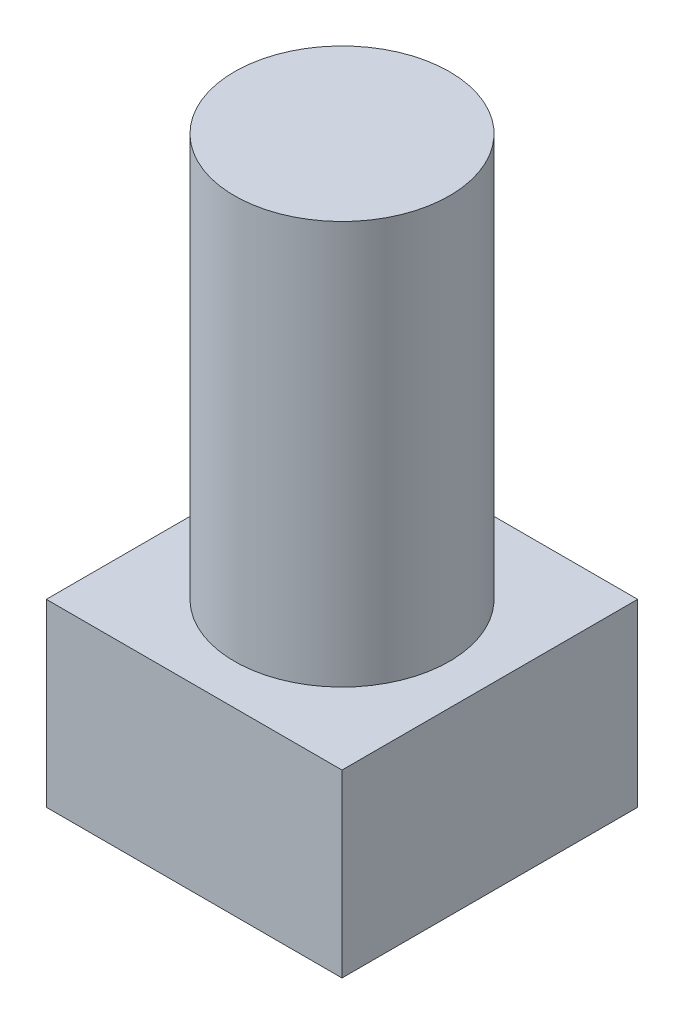
ISO-10303-21;
HEADER;
FILE_DESCRIPTION(('STEP AP214'),'2;1');
FILE_NAME('part.step','',(''),(''),'','','');
FILE_SCHEMA(('AUTOMOTIVE_DESIGN { 1 0 10303 214 1 1 1 1 }'));
ENDSEC;
DATA;
#1=APPLICATION_CONTEXT('core data for automotive mechanical design processes');
#2=APPLICATION_PROTOCOL_DEFINITION('international standard','automotive_design',2000,#1);
#3=PRODUCT_CONTEXT('',#1,'mechanical');
#4=PRODUCT('Part','Part','',(#3));
#5=PRODUCT_RELATED_PRODUCT_CATEGORY('part','',(#4));
#6=PRODUCT_DEFINITION_FORMATION('','',#4);
#7=PRODUCT_DEFINITION_CONTEXT('part definition',#1,'design');
#8=PRODUCT_DEFINITION('design','',#6,#7);
#9=PRODUCT_DEFINITION_SHAPE('','',#8);
#10=(LENGTH_UNIT() NAMED_UNIT(*) SI_UNIT(.MILLI.,.METRE.));
#11=(NAMED_UNIT(*) PLANE_ANGLE_UNIT() SI_UNIT($,.RADIAN.));
#12=(NAMED_UNIT(*) SI_UNIT($,.STERADIAN.) SOLID_ANGLE_UNIT());
#13=UNCERTAINTY_MEASURE_WITH_UNIT(LENGTH_MEASURE(1.E-05),#10,'distance_accuracy_value','');
#14=(GEOMETRIC_REPRESENTATION_CONTEXT(3) GLOBAL_UNCERTAINTY_ASSIGNED_CONTEXT((#13)) GLOBAL_UNIT_ASSIGNED_CONTEXT((#10,
#11,#12)) REPRESENTATION_CONTEXT('',''));
#15=CARTESIAN_POINT('',(0.,0.,0.));
#16=DIRECTION('',(0.,0.,1.));
#17=DIRECTION('',(1.,0.,0.));
#18=AXIS2_PLACEMENT_3D('',#15,#16,#17);
#19=CARTESIAN_POINT('',(8.,6.7,0.));
#20=DIRECTION('',(0.,1.,0.));
#21=DIRECTION('',(0.,0.,1.));
#22=AXIS2_PLACEMENT_3D('',#19,#20,#21);
#23=PLANE('',#22);
#24=CARTESIAN_POINT('',(0.,6.7,0.));
#25=DIRECTION('',(0.,-1.,0.));
#26=DIRECTION('',(0.,0.,-1.));
#27=AXIS2_PLACEMENT_3D('',#24,#25,#26);
#28=CIRCLE('',#27,4.);
#29=CARTESIAN_POINT('',(0.,6.7,-4.));
#30=VERTEX_POINT('',#29);
#31=EDGE_CURVE('E115',#30,#30,#28,.T.);
#32=ORIENTED_EDGE('',*,*,#31,.T.);
#33=EDGE_LOOP('',(#32));
#34=FACE_BOUND('',#33,.T.);
#35=DIRECTION('',(1.,0.,0.));
#36=VECTOR('',#35,1.);
#37=CARTESIAN_POINT('',(8.,6.7,5.5));
#38=LINE('',#37,#36);
#39=CARTESIAN_POINT('',(-5.5,6.7,5.5));
#40=VERTEX_POINT('',#39);
#41=CARTESIAN_POINT('',(5.5,6.7,5.5));
#42=VERTEX_POINT('',#41);
#43=EDGE_CURVE('E118',#40,#42,#38,.T.);
#44=ORIENTED_EDGE('',*,*,#43,.T.);
#45=DIRECTION('',(0.,0.,-1.));
#46=VECTOR('',#45,1.);
#47=CARTESIAN_POINT('',(5.5,6.7,0.));
#48=LINE('',#47,#46);
#49=CARTESIAN_POINT('',(5.5,6.7,-5.5));
#50=VERTEX_POINT('',#49);
#51=EDGE_CURVE('E12',#42,#50,#48,.T.);
#52=ORIENTED_EDGE('',*,*,#51,.T.);
#53=DIRECTION('',(-1.,0.,0.));
#54=VECTOR('',#53,1.);
#55=CARTESIAN_POINT('',(8.,6.7,-5.5));
#56=LINE('',#55,#54);
#57=CARTESIAN_POINT('',(-5.5,6.7,-5.5));
#58=VERTEX_POINT('',#57);
#59=EDGE_CURVE('E46',#50,#58,#56,.T.);
#60=ORIENTED_EDGE('',*,*,#59,.T.);
#61=DIRECTION('',(0.,0.,1.));
#62=VECTOR('',#61,1.);
#63=CARTESIAN_POINT('',(-5.5,6.7,0.));
#64=LINE('',#63,#62);
#65=EDGE_CURVE('E121',#58,#40,#64,.T.);
#66=ORIENTED_EDGE('',*,*,#65,.T.);
#67=EDGE_LOOP('',(#44,#52,#60,#66));
#68=FACE_BOUND('',#67,.T.);
#69=ADVANCED_FACE('F38',(#34,#68),#23,.T.);
#70=CARTESIAN_POINT('',(0.,0.,0.));
#71=DIRECTION('',(0.,-1.,0.));
#72=DIRECTION('',(0.,0.,-1.));
#73=AXIS2_PLACEMENT_3D('',#70,#71,#72);
#74=CYLINDRICAL_SURFACE('',#73,4.);
#75=CARTESIAN_POINT('',(0.,21.7,0.));
#76=DIRECTION('',(0.,-1.,0.));
#77=DIRECTION('',(0.,0.,-1.));
#78=AXIS2_PLACEMENT_3D('',#75,#76,#77);
#79=CIRCLE('',#78,4.);
#80=CARTESIAN_POINT('',(0.,21.7,-4.));
#81=VERTEX_POINT('',#80);
#82=EDGE_CURVE('E107',#81,#81,#79,.T.);
#83=ORIENTED_EDGE('',*,*,#82,.T.);
#84=EDGE_LOOP('',(#83));
#85=FACE_BOUND('',#84,.T.);
#86=ORIENTED_EDGE('',*,*,#31,.F.);
#87=EDGE_LOOP('',(#86));
#88=FACE_BOUND('',#87,.T.);
#89=ADVANCED_FACE('F145',(#85,#88),#74,.T.);
#90=CARTESIAN_POINT('',(4.,21.7,0.));
#91=DIRECTION('',(0.,1.,0.));
#92=DIRECTION('',(0.,0.,1.));
#93=AXIS2_PLACEMENT_3D('',#90,#91,#92);
#94=PLANE('',#93);
#95=ORIENTED_EDGE('',*,*,#82,.F.);
#96=EDGE_LOOP('',(#95));
#97=FACE_BOUND('',#96,.T.);
#98=ADVANCED_FACE('F150',(#97),#94,.T.);
#99=CARTESIAN_POINT('',(5.5,21.7,-5.5));
#100=DIRECTION('',(1.,0.,0.));
#101=DIRECTION('',(0.,0.,-1.));
#102=AXIS2_PLACEMENT_3D('',#99,#100,#101);
#103=PLANE('',#102);
#104=DIRECTION('',(0.,-1.,0.));
#105=VECTOR('',#104,1.);
#106=CARTESIAN_POINT('',(5.5,21.7,5.5));
#107=LINE('',#106,#105);
#108=CARTESIAN_POINT('',(5.5,0.,5.5));
#109=VERTEX_POINT('',#108);
#110=EDGE_CURVE('E61',#42,#109,#107,.T.);
#111=ORIENTED_EDGE('',*,*,#110,.T.);
#112=DIRECTION('',(0.,0.,1.));
#113=VECTOR('',#112,1.);
#114=CARTESIAN_POINT('',(5.5,0.,-5.5));
#115=LINE('',#114,#113);
#116=CARTESIAN_POINT('',(5.5,0.,-5.5));
#117=VERTEX_POINT('',#116);
#118=EDGE_CURVE('E90',#117,#109,#115,.T.);
#119=ORIENTED_EDGE('',*,*,#118,.F.);
#120=DIRECTION('',(0.,-1.,0.));
#121=VECTOR('',#120,1.);
#122=CARTESIAN_POINT('',(5.5,21.7,-5.5));
#123=LINE('',#122,#121);
#124=EDGE_CURVE('E105',#50,#117,#123,.T.);
#125=ORIENTED_EDGE('',*,*,#124,.F.);
#126=ORIENTED_EDGE('',*,*,#51,.F.);
#127=EDGE_LOOP('',(#111,#119,#125,#126));
#128=FACE_BOUND('',#127,.T.);
#129=ADVANCED_FACE('F132',(#128),#103,.T.);
#130=CARTESIAN_POINT('',(-5.5,21.7,-5.5));
#131=DIRECTION('',(0.,0.,-1.));
#132=DIRECTION('',(-1.,0.,0.));
#133=AXIS2_PLACEMENT_3D('',#130,#131,#132);
#134=PLANE('',#133);
#135=ORIENTED_EDGE('',*,*,#124,.T.);
#136=DIRECTION('',(1.,0.,0.));
#137=VECTOR('',#136,1.);
#138=CARTESIAN_POINT('',(-5.5,0.,-5.5));
#139=LINE('',#138,#137);
#140=CARTESIAN_POINT('',(-5.5,0.,-5.5));
#141=VERTEX_POINT('',#140);
#142=EDGE_CURVE('E102',#141,#117,#139,.T.);
#143=ORIENTED_EDGE('',*,*,#142,.F.);
#144=DIRECTION('',(0.,-1.,0.));
#145=VECTOR('',#144,1.);
#146=CARTESIAN_POINT('',(-5.5,21.7,-5.5));
#147=LINE('',#146,#145);
#148=EDGE_CURVE('E108',#58,#141,#147,.T.);
#149=ORIENTED_EDGE('',*,*,#148,.F.);
#150=ORIENTED_EDGE('',*,*,#59,.F.);
#151=EDGE_LOOP('',(#135,#143,#149,#150));
#152=FACE_BOUND('',#151,.T.);
#153=ADVANCED_FACE('F128',(#152),#134,.T.);
#154=CARTESIAN_POINT('',(-5.5,21.7,-5.5));
#155=DIRECTION('',(-1.,0.,0.));
#156=DIRECTION('',(0.,0.,1.));
#157=AXIS2_PLACEMENT_3D('',#154,#155,#156);
#158=PLANE('',#157);
#159=ORIENTED_EDGE('',*,*,#148,.T.);
#160=DIRECTION('',(0.,0.,-1.));
#161=VECTOR('',#160,1.);
#162=CARTESIAN_POINT('',(-5.5,0.,-5.5));
#163=LINE('',#162,#161);
#164=CARTESIAN_POINT('',(-5.5,0.,5.5));
#165=VERTEX_POINT('',#164);
#166=EDGE_CURVE('E53',#165,#141,#163,.T.);
#167=ORIENTED_EDGE('',*,*,#166,.F.);
#168=DIRECTION('',(0.,-1.,0.));
#169=VECTOR('',#168,1.);
#170=CARTESIAN_POINT('',(-5.5,21.7,5.5));
#171=LINE('',#170,#169);
#172=EDGE_CURVE('E110',#40,#165,#171,.T.);
#173=ORIENTED_EDGE('',*,*,#172,.F.);
#174=ORIENTED_EDGE('',*,*,#65,.F.);
#175=EDGE_LOOP('',(#159,#167,#173,#174));
#176=FACE_BOUND('',#175,.T.);
#177=ADVANCED_FACE('F135',(#176),#158,.T.);
#178=CARTESIAN_POINT('',(-5.5,21.7,5.5));
#179=DIRECTION('',(0.,0.,1.));
#180=DIRECTION('',(1.,0.,0.));
#181=AXIS2_PLACEMENT_3D('',#178,#179,#180);
#182=PLANE('',#181);
#183=ORIENTED_EDGE('',*,*,#172,.T.);
#184=DIRECTION('',(-1.,0.,0.));
#185=VECTOR('',#184,1.);
#186=CARTESIAN_POINT('',(-5.5,0.,5.5));
#187=LINE('',#186,#185);
#188=EDGE_CURVE('E94',#109,#165,#187,.T.);
#189=ORIENTED_EDGE('',*,*,#188,.F.);
#190=ORIENTED_EDGE('',*,*,#110,.F.);
#191=ORIENTED_EDGE('',*,*,#43,.F.);
#192=EDGE_LOOP('',(#183,#189,#190,#191));
#193=FACE_BOUND('',#192,.T.);
#194=ADVANCED_FACE('F134',(#193),#182,.T.);
#195=CARTESIAN_POINT('',(0.,0.,0.));
#196=DIRECTION('',(0.,-1.,0.));
#197=DIRECTION('',(0.,0.,-1.));
#198=AXIS2_PLACEMENT_3D('',#195,#196,#197);
#199=PLANE('',#198);
#200=CARTESIAN_POINT('',(0.,0.,0.));
#201=DIRECTION('',(0.,-1.,0.));
#202=DIRECTION('',(0.,0.,-1.));
#203=AXIS2_PLACEMENT_3D('',#200,#201,#202);
#204=CIRCLE('',#203,1.65);
#205=CARTESIAN_POINT('',(0.,0.,-1.65));
#206=VERTEX_POINT('',#205);
#207=EDGE_CURVE('E91',#206,#206,#204,.T.);
#208=ORIENTED_EDGE('',*,*,#207,.F.);
#209=EDGE_LOOP('',(#208));
#210=FACE_BOUND('',#209,.T.);
#211=ORIENTED_EDGE('',*,*,#142,.T.);
#212=ORIENTED_EDGE('',*,*,#118,.T.);
#213=ORIENTED_EDGE('',*,*,#188,.T.);
#214=ORIENTED_EDGE('',*,*,#166,.T.);
#215=EDGE_LOOP('',(#211,#212,#213,#214));
#216=FACE_BOUND('',#215,.T.);
#217=ADVANCED_FACE('F40',(#210,#216),#199,.T.);
#218=CARTESIAN_POINT('',(0.,9.,0.));
#219=DIRECTION('',(0.,-1.,0.));
#220=DIRECTION('',(0.,0.,-1.));
#221=AXIS2_PLACEMENT_3D('',#218,#219,#220);
#222=CONICAL_SURFACE('',#221,1.65,1.02974425867665);
#223=CARTESIAN_POINT('',(0.,9.99142002139548,0.));
#224=VERTEX_POINT('',#223);
#225=VERTEX_LOOP('',#224);
#226=FACE_BOUND('',#225,.T.);
#227=CARTESIAN_POINT('',(0.,9.,0.));
#228=DIRECTION('',(0.,-1.,0.));
#229=DIRECTION('',(0.,0.,-1.));
#230=AXIS2_PLACEMENT_3D('',#227,#228,#229);
#231=CIRCLE('',#230,1.65);
#232=CARTESIAN_POINT('',(0.,9.,-1.65));
#233=VERTEX_POINT('',#232);
#234=EDGE_CURVE('E88',#233,#233,#231,.T.);
#235=ORIENTED_EDGE('',*,*,#234,.T.);
#236=EDGE_LOOP('',(#235));
#237=FACE_BOUND('',#236,.T.);
#238=ADVANCED_FACE('F81',(#226,#237),#222,.F.);
#239=CARTESIAN_POINT('',(0.,0.,0.));
#240=DIRECTION('',(0.,-1.,0.));
#241=DIRECTION('',(0.,0.,-1.));
#242=AXIS2_PLACEMENT_3D('',#239,#240,#241);
#243=CYLINDRICAL_SURFACE('',#242,1.65);
#244=ORIENTED_EDGE('',*,*,#234,.F.);
#245=EDGE_LOOP('',(#244));
#246=FACE_BOUND('',#245,.T.);
#247=ORIENTED_EDGE('',*,*,#207,.T.);
#248=EDGE_LOOP('',(#247));
#249=FACE_BOUND('',#248,.T.);
#250=ADVANCED_FACE('F84',(#246,#249),#243,.F.);
#251=CLOSED_SHELL('',(#69,#89,#98,#129,#153,#177,#194,#217,#238,#250));
#252=MANIFOLD_SOLID_BREP('B2',#251);
#253=ADVANCED_BREP_SHAPE_REPRESENTATION('',(#18,#252),#14);
#254=SHAPE_DEFINITION_REPRESENTATION(#9,#253);
ENDSEC;
END-ISO-10303-21;
